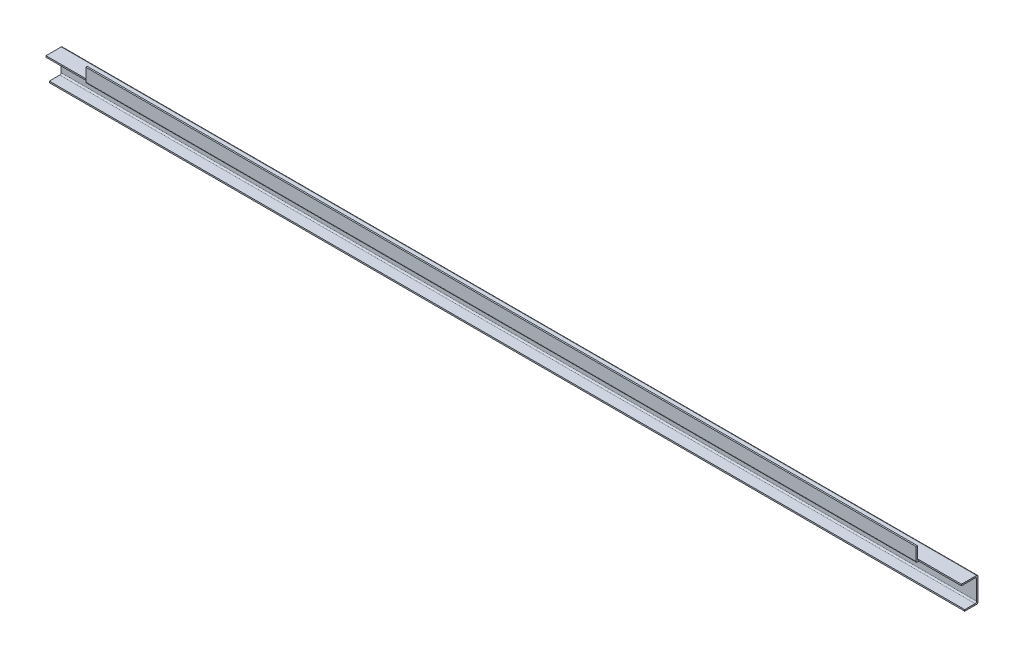
ISO-10303-21;
HEADER;
FILE_DESCRIPTION(('STEP AP214'),'2;1');
FILE_NAME('part.step','',(''),(''),'','','');
FILE_SCHEMA(('AUTOMOTIVE_DESIGN { 1 0 10303 214 1 1 1 1 }'));
ENDSEC;
DATA;
#1=APPLICATION_CONTEXT('core data for automotive mechanical design processes');
#2=APPLICATION_PROTOCOL_DEFINITION('international standard','automotive_design',2000,#1);
#3=PRODUCT_CONTEXT('',#1,'mechanical');
#4=PRODUCT('Part','Part','',(#3));
#5=PRODUCT_RELATED_PRODUCT_CATEGORY('part','',(#4));
#6=PRODUCT_DEFINITION_FORMATION('','',#4);
#7=PRODUCT_DEFINITION_CONTEXT('part definition',#1,'design');
#8=PRODUCT_DEFINITION('design','',#6,#7);
#9=PRODUCT_DEFINITION_SHAPE('','',#8);
#10=(LENGTH_UNIT() NAMED_UNIT(*) SI_UNIT(.MILLI.,.METRE.));
#11=(NAMED_UNIT(*) PLANE_ANGLE_UNIT() SI_UNIT($,.RADIAN.));
#12=(NAMED_UNIT(*) SI_UNIT($,.STERADIAN.) SOLID_ANGLE_UNIT());
#13=UNCERTAINTY_MEASURE_WITH_UNIT(LENGTH_MEASURE(1.E-05),#10,'distance_accuracy_value','');
#14=(GEOMETRIC_REPRESENTATION_CONTEXT(3) GLOBAL_UNCERTAINTY_ASSIGNED_CONTEXT((#13)) GLOBAL_UNIT_ASSIGNED_CONTEXT((#10,
#11,#12)) REPRESENTATION_CONTEXT('',''));
#15=CARTESIAN_POINT('',(0.,0.,0.));
#16=DIRECTION('',(0.,0.,1.));
#17=DIRECTION('',(1.,0.,0.));
#18=AXIS2_PLACEMENT_3D('',#15,#16,#17);
#19=CARTESIAN_POINT('',(1934.,0.,0.));
#20=DIRECTION('',(1.,0.,0.));
#21=DIRECTION('',(0.,0.,-1.));
#22=AXIS2_PLACEMENT_3D('',#19,#20,#21);
#23=PLANE('',#22);
#24=DIRECTION('',(0.,0.,1.));
#25=VECTOR('',#24,1.);
#26=CARTESIAN_POINT('',(1934.,50.,-28.));
#27=LINE('',#26,#25);
#28=CARTESIAN_POINT('',(1934.,50.,-25.));
#29=VERTEX_POINT('',#28);
#30=CARTESIAN_POINT('',(1934.,50.,7.00000000000001));
#31=VERTEX_POINT('',#30);
#32=EDGE_CURVE('E226',#29,#31,#27,.T.);
#33=ORIENTED_EDGE('',*,*,#32,.T.);
#34=DIRECTION('',(0.,1.,0.));
#35=VECTOR('',#34,1.);
#36=CARTESIAN_POINT('',(1934.,47.,7.00000000000001));
#37=LINE('',#36,#35);
#38=CARTESIAN_POINT('',(1934.,47.,7.00000000000001));
#39=VERTEX_POINT('',#38);
#40=EDGE_CURVE('E173',#39,#31,#37,.T.);
#41=ORIENTED_EDGE('',*,*,#40,.F.);
#42=DIRECTION('',(0.,0.,-1.));
#43=VECTOR('',#42,1.);
#44=CARTESIAN_POINT('',(1934.,47.,-25.));
#45=LINE('',#44,#43);
#46=CARTESIAN_POINT('',(1934.,47.,-22.));
#47=VERTEX_POINT('',#46);
#48=EDGE_CURVE('E183',#39,#47,#45,.T.);
#49=ORIENTED_EDGE('',*,*,#48,.T.);
#50=CARTESIAN_POINT('',(1934.,44.,-22.));
#51=DIRECTION('',(1.,0.,0.));
#52=DIRECTION('',(0.,0.,-1.));
#53=AXIS2_PLACEMENT_3D('',#50,#51,#52);
#54=CIRCLE('',#53,3.);
#55=CARTESIAN_POINT('',(1934.,44.,-25.));
#56=VERTEX_POINT('',#55);
#57=EDGE_CURVE('E307',#47,#56,#54,.F.);
#58=ORIENTED_EDGE('',*,*,#57,.T.);
#59=DIRECTION('',(0.,-1.,0.));
#60=VECTOR('',#59,1.);
#61=CARTESIAN_POINT('',(1934.,0.,-25.));
#62=LINE('',#61,#60);
#63=CARTESIAN_POINT('',(1934.,3.,-25.));
#64=VERTEX_POINT('',#63);
#65=EDGE_CURVE('E230',#56,#64,#62,.T.);
#66=ORIENTED_EDGE('',*,*,#65,.T.);
#67=CARTESIAN_POINT('',(1934.,3.,-22.));
#68=DIRECTION('',(1.,0.,0.));
#69=DIRECTION('',(0.,0.,-1.));
#70=AXIS2_PLACEMENT_3D('',#67,#68,#69);
#71=CIRCLE('',#70,3.);
#72=CARTESIAN_POINT('',(1934.,0.,-22.));
#73=VERTEX_POINT('',#72);
#74=EDGE_CURVE('E302',#64,#73,#71,.F.);
#75=ORIENTED_EDGE('',*,*,#74,.T.);
#76=DIRECTION('',(0.,0.,1.));
#77=VECTOR('',#76,1.);
#78=CARTESIAN_POINT('',(1934.,0.,0.));
#79=LINE('',#78,#77);
#80=CARTESIAN_POINT('',(1934.,0.,0.));
#81=VERTEX_POINT('',#80);
#82=EDGE_CURVE('E233',#73,#81,#79,.T.);
#83=ORIENTED_EDGE('',*,*,#82,.T.);
#84=DIRECTION('',(0.,-1.,0.));
#85=VECTOR('',#84,1.);
#86=CARTESIAN_POINT('',(1934.,0.,0.));
#87=LINE('',#86,#85);
#88=CARTESIAN_POINT('',(1934.,-3.,0.));
#89=VERTEX_POINT('',#88);
#90=EDGE_CURVE('E216',#81,#89,#87,.T.);
#91=ORIENTED_EDGE('',*,*,#90,.T.);
#92=DIRECTION('',(0.,0.,-1.));
#93=VECTOR('',#92,1.);
#94=CARTESIAN_POINT('',(1934.,-3.,0.));
#95=LINE('',#94,#93);
#96=CARTESIAN_POINT('',(1934.,-3.,-25.));
#97=VERTEX_POINT('',#96);
#98=EDGE_CURVE('E219',#89,#97,#95,.T.);
#99=ORIENTED_EDGE('',*,*,#98,.T.);
#100=CARTESIAN_POINT('',(1934.,0.,-25.));
#101=DIRECTION('',(1.,0.,0.));
#102=DIRECTION('',(0.,0.,-1.));
#103=AXIS2_PLACEMENT_3D('',#100,#101,#102);
#104=CIRCLE('',#103,3.);
#105=CARTESIAN_POINT('',(1934.,0.,-28.));
#106=VERTEX_POINT('',#105);
#107=EDGE_CURVE('E275',#97,#106,#104,.T.);
#108=ORIENTED_EDGE('',*,*,#107,.T.);
#109=DIRECTION('',(0.,1.,0.));
#110=VECTOR('',#109,1.);
#111=CARTESIAN_POINT('',(1934.,-3.,-28.));
#112=LINE('',#111,#110);
#113=CARTESIAN_POINT('',(1934.,47.,-28.));
#114=VERTEX_POINT('',#113);
#115=EDGE_CURVE('E223',#106,#114,#112,.T.);
#116=ORIENTED_EDGE('',*,*,#115,.T.);
#117=CARTESIAN_POINT('',(1934.,47.,-25.));
#118=DIRECTION('',(1.,0.,0.));
#119=DIRECTION('',(0.,0.,-1.));
#120=AXIS2_PLACEMENT_3D('',#117,#118,#119);
#121=CIRCLE('',#120,3.);
#122=EDGE_CURVE('E273',#114,#29,#121,.T.);
#123=ORIENTED_EDGE('',*,*,#122,.T.);
#124=EDGE_LOOP('',(#33,#41,#49,#58,#66,#75,#83,#91,#99,#108,#116,#123));
#125=FACE_BOUND('',#124,.T.);
#126=ADVANCED_FACE('F33',(#125),#23,.T.);
#127=CARTESIAN_POINT('',(1934.,0.,0.));
#128=DIRECTION('',(0.,0.,-1.));
#129=DIRECTION('',(-1.,0.,0.));
#130=AXIS2_PLACEMENT_3D('',#127,#128,#129);
#131=PLANE('',#130);
#132=DIRECTION('',(0.,-1.,0.));
#133=VECTOR('',#132,1.);
#134=CARTESIAN_POINT('',(0.,0.,0.));
#135=LINE('',#134,#133);
#136=CARTESIAN_POINT('',(0.,0.,0.));
#137=VERTEX_POINT('',#136);
#138=CARTESIAN_POINT('',(0.,-3.,0.));
#139=VERTEX_POINT('',#138);
#140=EDGE_CURVE('E215',#137,#139,#135,.T.);
#141=ORIENTED_EDGE('',*,*,#140,.T.);
#142=DIRECTION('',(-1.,0.,0.));
#143=VECTOR('',#142,1.);
#144=CARTESIAN_POINT('',(1934.,-3.,0.));
#145=LINE('',#144,#143);
#146=EDGE_CURVE('E259',#89,#139,#145,.T.);
#147=ORIENTED_EDGE('',*,*,#146,.F.);
#148=ORIENTED_EDGE('',*,*,#90,.F.);
#149=DIRECTION('',(-1.,0.,0.));
#150=VECTOR('',#149,1.);
#151=CARTESIAN_POINT('',(1934.,0.,0.));
#152=LINE('',#151,#150);
#153=EDGE_CURVE('E235',#81,#137,#152,.T.);
#154=ORIENTED_EDGE('',*,*,#153,.T.);
#155=EDGE_LOOP('',(#141,#147,#148,#154));
#156=FACE_BOUND('',#155,.T.);
#157=ADVANCED_FACE('F330',(#156),#131,.F.);
#158=CARTESIAN_POINT('',(1934.,-3.,0.));
#159=DIRECTION('',(0.,1.,0.));
#160=DIRECTION('',(0.,0.,1.));
#161=AXIS2_PLACEMENT_3D('',#158,#159,#160);
#162=PLANE('',#161);
#163=DIRECTION('',(0.,0.,-1.));
#164=VECTOR('',#163,1.);
#165=CARTESIAN_POINT('',(0.,-3.,0.));
#166=LINE('',#165,#164);
#167=CARTESIAN_POINT('',(0.,-3.,-25.));
#168=VERTEX_POINT('',#167);
#169=EDGE_CURVE('E238',#139,#168,#166,.T.);
#170=ORIENTED_EDGE('',*,*,#169,.T.);
#171=DIRECTION('',(-1.,0.,0.));
#172=VECTOR('',#171,1.);
#173=CARTESIAN_POINT('',(1934.,-3.,-25.));
#174=LINE('',#173,#172);
#175=EDGE_CURVE('E271',#168,#97,#174,.F.);
#176=ORIENTED_EDGE('',*,*,#175,.T.);
#177=ORIENTED_EDGE('',*,*,#98,.F.);
#178=ORIENTED_EDGE('',*,*,#146,.T.);
#179=EDGE_LOOP('',(#170,#176,#177,#178));
#180=FACE_BOUND('',#179,.T.);
#181=ADVANCED_FACE('F336',(#180),#162,.F.);
#182=CARTESIAN_POINT('',(1934.,-3.,-28.));
#183=DIRECTION('',(0.,0.,1.));
#184=DIRECTION('',(1.,0.,0.));
#185=AXIS2_PLACEMENT_3D('',#182,#183,#184);
#186=PLANE('',#185);
#187=ORIENTED_EDGE('',*,*,#115,.F.);
#188=DIRECTION('',(-1.,0.,0.));
#189=VECTOR('',#188,1.);
#190=CARTESIAN_POINT('',(1934.,0.,-28.));
#191=LINE('',#190,#189);
#192=CARTESIAN_POINT('',(0.,0.,-28.));
#193=VERTEX_POINT('',#192);
#194=EDGE_CURVE('E264',#106,#193,#191,.T.);
#195=ORIENTED_EDGE('',*,*,#194,.T.);
#196=DIRECTION('',(0.,1.,0.));
#197=VECTOR('',#196,1.);
#198=CARTESIAN_POINT('',(0.,-3.,-28.));
#199=LINE('',#198,#197);
#200=CARTESIAN_POINT('',(0.,47.,-28.));
#201=VERTEX_POINT('',#200);
#202=EDGE_CURVE('E241',#193,#201,#199,.T.);
#203=ORIENTED_EDGE('',*,*,#202,.T.);
#204=DIRECTION('',(-1.,0.,0.));
#205=VECTOR('',#204,1.);
#206=CARTESIAN_POINT('',(1934.,47.,-28.));
#207=LINE('',#206,#205);
#208=EDGE_CURVE('E262',#201,#114,#207,.F.);
#209=ORIENTED_EDGE('',*,*,#208,.T.);
#210=EDGE_LOOP('',(#187,#195,#203,#209));
#211=FACE_BOUND('',#210,.T.);
#212=ADVANCED_FACE('F369',(#211),#186,.F.);
#213=CARTESIAN_POINT('',(1934.,50.,-28.));
#214=DIRECTION('',(0.,-1.,0.));
#215=DIRECTION('',(0.,0.,-1.));
#216=AXIS2_PLACEMENT_3D('',#213,#214,#215);
#217=PLANE('',#216);
#218=ORIENTED_EDGE('',*,*,#32,.F.);
#219=DIRECTION('',(-1.,0.,0.));
#220=VECTOR('',#219,1.);
#221=CARTESIAN_POINT('',(1934.,50.,-25.));
#222=LINE('',#221,#220);
#223=CARTESIAN_POINT('',(0.,50.,-25.));
#224=VERTEX_POINT('',#223);
#225=EDGE_CURVE('E280',#29,#224,#222,.T.);
#226=ORIENTED_EDGE('',*,*,#225,.T.);
#227=DIRECTION('',(0.,0.,1.));
#228=VECTOR('',#227,1.);
#229=CARTESIAN_POINT('',(0.,50.,-28.));
#230=LINE('',#229,#228);
#231=CARTESIAN_POINT('',(0.,50.,7.00000000000001));
#232=VERTEX_POINT('',#231);
#233=EDGE_CURVE('E244',#224,#232,#230,.T.);
#234=ORIENTED_EDGE('',*,*,#233,.T.);
#235=DIRECTION('',(-1.,0.,0.));
#236=VECTOR('',#235,1.);
#237=CARTESIAN_POINT('',(1934.,50.,7.));
#238=LINE('',#237,#236);
#239=CARTESIAN_POINT('',(90.,50.,7.00000000000001));
#240=VERTEX_POINT('',#239);
#241=EDGE_CURVE('E277',#232,#240,#238,.F.);
#242=ORIENTED_EDGE('',*,*,#241,.T.);
#243=CARTESIAN_POINT('',(1844.,50.,7.00000000000001));
#244=VERTEX_POINT('',#243);
#245=EDGE_CURVE('E281',#240,#244,#238,.F.);
#246=ORIENTED_EDGE('',*,*,#245,.T.);
#247=EDGE_CURVE('E171',#244,#31,#238,.F.);
#248=ORIENTED_EDGE('',*,*,#247,.T.);
#249=EDGE_LOOP('',(#218,#226,#234,#242,#246,#248));
#250=FACE_BOUND('',#249,.T.);
#251=ADVANCED_FACE('F365',(#250),#217,.F.);
#252=CARTESIAN_POINT('',(1934.,50.,10.));
#253=DIRECTION('',(0.,0.,1.));
#254=DIRECTION('',(1.,0.,0.));
#255=AXIS2_PLACEMENT_3D('',#252,#253,#254);
#256=PLANE('',#255);
#257=DIRECTION('',(-1.,0.,0.));
#258=VECTOR('',#257,1.);
#259=CARTESIAN_POINT('',(1934.,77.,10.));
#260=LINE('',#259,#258);
#261=CARTESIAN_POINT('',(1844.,77.,10.));
#262=VERTEX_POINT('',#261);
#263=CARTESIAN_POINT('',(90.,77.,10.));
#264=VERTEX_POINT('',#263);
#265=EDGE_CURVE('E257',#262,#264,#260,.T.);
#266=ORIENTED_EDGE('',*,*,#265,.F.);
#267=DIRECTION('',(0.,-1.,0.));
#268=VECTOR('',#267,1.);
#269=CARTESIAN_POINT('',(1844.,50.,10.));
#270=LINE('',#269,#268);
#271=CARTESIAN_POINT('',(1844.,53.,10.));
#272=VERTEX_POINT('',#271);
#273=EDGE_CURVE('E190',#262,#272,#270,.T.);
#274=ORIENTED_EDGE('',*,*,#273,.T.);
#275=DIRECTION('',(-1.,0.,0.));
#276=VECTOR('',#275,1.);
#277=CARTESIAN_POINT('',(0.,53.,10.));
#278=LINE('',#277,#276);
#279=CARTESIAN_POINT('',(90.0000000000001,53.,10.));
#280=VERTEX_POINT('',#279);
#281=EDGE_CURVE('E284',#272,#280,#278,.T.);
#282=ORIENTED_EDGE('',*,*,#281,.T.);
#283=DIRECTION('',(0.,1.,0.));
#284=VECTOR('',#283,1.);
#285=CARTESIAN_POINT('',(90.0000000000001,50.,10.));
#286=LINE('',#285,#284);
#287=EDGE_CURVE('E212',#280,#264,#286,.T.);
#288=ORIENTED_EDGE('',*,*,#287,.T.);
#289=EDGE_LOOP('',(#266,#274,#282,#288));
#290=FACE_BOUND('',#289,.T.);
#291=ADVANCED_FACE('F361',(#290),#256,.F.);
#292=CARTESIAN_POINT('',(1934.,77.,13.));
#293=DIRECTION('',(0.,-1.,0.));
#294=DIRECTION('',(0.,0.,-1.));
#295=AXIS2_PLACEMENT_3D('',#292,#293,#294);
#296=PLANE('',#295);
#297=DIRECTION('',(-1.,0.,0.));
#298=VECTOR('',#297,1.);
#299=CARTESIAN_POINT('',(1934.,77.,13.));
#300=LINE('',#299,#298);
#301=CARTESIAN_POINT('',(1844.,77.,13.));
#302=VERTEX_POINT('',#301);
#303=CARTESIAN_POINT('',(90.,77.,13.));
#304=VERTEX_POINT('',#303);
#305=EDGE_CURVE('E255',#302,#304,#300,.T.);
#306=ORIENTED_EDGE('',*,*,#305,.F.);
#307=DIRECTION('',(0.,0.,1.));
#308=VECTOR('',#307,1.);
#309=CARTESIAN_POINT('',(1844.,77.,7.00000000000001));
#310=LINE('',#309,#308);
#311=EDGE_CURVE('E178',#262,#302,#310,.T.);
#312=ORIENTED_EDGE('',*,*,#311,.F.);
#313=ORIENTED_EDGE('',*,*,#265,.T.);
#314=DIRECTION('',(0.,0.,1.));
#315=VECTOR('',#314,1.);
#316=CARTESIAN_POINT('',(90.,77.,7.00000000000001));
#317=LINE('',#316,#315);
#318=EDGE_CURVE('E205',#264,#304,#317,.T.);
#319=ORIENTED_EDGE('',*,*,#318,.T.);
#320=EDGE_LOOP('',(#306,#312,#313,#319));
#321=FACE_BOUND('',#320,.T.);
#322=ADVANCED_FACE('F358',(#321),#296,.F.);
#323=CARTESIAN_POINT('',(1934.,47.,13.));
#324=DIRECTION('',(0.,0.,-1.));
#325=DIRECTION('',(0.,1.,0.));
#326=AXIS2_PLACEMENT_3D('',#323,#324,#325);
#327=PLANE('',#326);
#328=DIRECTION('',(-1.,0.,0.));
#329=VECTOR('',#328,1.);
#330=CARTESIAN_POINT('',(1934.,50.,13.));
#331=LINE('',#330,#329);
#332=CARTESIAN_POINT('',(90.,50.,13.));
#333=VERTEX_POINT('',#332);
#334=CARTESIAN_POINT('',(1844.,50.,13.));
#335=VERTEX_POINT('',#334);
#336=EDGE_CURVE('E297',#333,#335,#331,.F.);
#337=ORIENTED_EDGE('',*,*,#336,.T.);
#338=DIRECTION('',(0.,-1.,0.));
#339=VECTOR('',#338,1.);
#340=CARTESIAN_POINT('',(1844.,77.,13.));
#341=LINE('',#340,#339);
#342=EDGE_CURVE('E47',#302,#335,#341,.T.);
#343=ORIENTED_EDGE('',*,*,#342,.F.);
#344=ORIENTED_EDGE('',*,*,#305,.T.);
#345=DIRECTION('',(0.,1.,0.));
#346=VECTOR('',#345,1.);
#347=CARTESIAN_POINT('',(90.,77.,13.));
#348=LINE('',#347,#346);
#349=EDGE_CURVE('E193',#333,#304,#348,.T.);
#350=ORIENTED_EDGE('',*,*,#349,.F.);
#351=EDGE_LOOP('',(#337,#343,#344,#350));
#352=FACE_BOUND('',#351,.T.);
#353=ADVANCED_FACE('F316',(#352),#327,.F.);
#354=CARTESIAN_POINT('',(1934.,47.,-25.));
#355=DIRECTION('',(0.,1.,0.));
#356=DIRECTION('',(0.,0.,1.));
#357=AXIS2_PLACEMENT_3D('',#354,#355,#356);
#358=PLANE('',#357);
#359=DIRECTION('',(1.,0.,0.));
#360=VECTOR('',#359,1.);
#361=CARTESIAN_POINT('',(1844.,47.,7.00000000000001));
#362=LINE('',#361,#360);
#363=CARTESIAN_POINT('',(1844.,47.,7.00000000000001));
#364=VERTEX_POINT('',#363);
#365=EDGE_CURVE('E168',#364,#39,#362,.T.);
#366=ORIENTED_EDGE('',*,*,#365,.F.);
#367=DIRECTION('',(0.,0.,1.));
#368=VECTOR('',#367,1.);
#369=CARTESIAN_POINT('',(1844.,47.,7.00000000000001));
#370=LINE('',#369,#368);
#371=CARTESIAN_POINT('',(1844.,47.,10.));
#372=VERTEX_POINT('',#371);
#373=EDGE_CURVE('E175',#364,#372,#370,.T.);
#374=ORIENTED_EDGE('',*,*,#373,.T.);
#375=DIRECTION('',(-1.,0.,0.));
#376=VECTOR('',#375,1.);
#377=CARTESIAN_POINT('',(1934.,47.,10.));
#378=LINE('',#377,#376);
#379=CARTESIAN_POINT('',(90.0000000000001,47.,10.));
#380=VERTEX_POINT('',#379);
#381=EDGE_CURVE('E55',#372,#380,#378,.T.);
#382=ORIENTED_EDGE('',*,*,#381,.T.);
#383=DIRECTION('',(0.,0.,1.));
#384=VECTOR('',#383,1.);
#385=CARTESIAN_POINT('',(90.,47.,7.00000000000001));
#386=LINE('',#385,#384);
#387=CARTESIAN_POINT('',(90.,47.,7.00000000000001));
#388=VERTEX_POINT('',#387);
#389=EDGE_CURVE('E202',#388,#380,#386,.T.);
#390=ORIENTED_EDGE('',*,*,#389,.F.);
#391=DIRECTION('',(1.,0.,0.));
#392=VECTOR('',#391,1.);
#393=CARTESIAN_POINT('',(90.,47.,7.00000000000001));
#394=LINE('',#393,#392);
#395=CARTESIAN_POINT('',(0.,47.,7.00000000000001));
#396=VERTEX_POINT('',#395);
#397=EDGE_CURVE('E196',#396,#388,#394,.T.);
#398=ORIENTED_EDGE('',*,*,#397,.F.);
#399=DIRECTION('',(0.,0.,-1.));
#400=VECTOR('',#399,1.);
#401=CARTESIAN_POINT('',(0.,47.,-25.));
#402=LINE('',#401,#400);
#403=CARTESIAN_POINT('',(0.,47.,-22.));
#404=VERTEX_POINT('',#403);
#405=EDGE_CURVE('E247',#396,#404,#402,.T.);
#406=ORIENTED_EDGE('',*,*,#405,.T.);
#407=DIRECTION('',(-1.,0.,0.));
#408=VECTOR('',#407,1.);
#409=CARTESIAN_POINT('',(1934.,47.,-22.));
#410=LINE('',#409,#408);
#411=EDGE_CURVE('E295',#404,#47,#410,.F.);
#412=ORIENTED_EDGE('',*,*,#411,.T.);
#413=ORIENTED_EDGE('',*,*,#48,.F.);
#414=EDGE_LOOP('',(#366,#374,#382,#390,#398,#406,#412,#413));
#415=FACE_BOUND('',#414,.T.);
#416=ADVANCED_FACE('F181',(#415),#358,.F.);
#417=CARTESIAN_POINT('',(1934.,0.,-25.));
#418=DIRECTION('',(0.,0.,-1.));
#419=DIRECTION('',(-1.,0.,0.));
#420=AXIS2_PLACEMENT_3D('',#417,#418,#419);
#421=PLANE('',#420);
#422=DIRECTION('',(0.,-1.,0.));
#423=VECTOR('',#422,1.);
#424=CARTESIAN_POINT('',(0.,0.,-25.));
#425=LINE('',#424,#423);
#426=CARTESIAN_POINT('',(0.,44.,-25.));
#427=VERTEX_POINT('',#426);
#428=CARTESIAN_POINT('',(0.,3.,-25.));
#429=VERTEX_POINT('',#428);
#430=EDGE_CURVE('E249',#427,#429,#425,.T.);
#431=ORIENTED_EDGE('',*,*,#430,.T.);
#432=DIRECTION('',(-1.,0.,0.));
#433=VECTOR('',#432,1.);
#434=CARTESIAN_POINT('',(1934.,3.,-25.));
#435=LINE('',#434,#433);
#436=EDGE_CURVE('E292',#429,#64,#435,.F.);
#437=ORIENTED_EDGE('',*,*,#436,.T.);
#438=ORIENTED_EDGE('',*,*,#65,.F.);
#439=DIRECTION('',(-1.,0.,0.));
#440=VECTOR('',#439,1.);
#441=CARTESIAN_POINT('',(0.,44.,-25.));
#442=LINE('',#441,#440);
#443=EDGE_CURVE('E289',#56,#427,#442,.T.);
#444=ORIENTED_EDGE('',*,*,#443,.T.);
#445=EDGE_LOOP('',(#431,#437,#438,#444));
#446=FACE_BOUND('',#445,.T.);
#447=ADVANCED_FACE('F349',(#446),#421,.F.);
#448=CARTESIAN_POINT('',(1934.,0.,0.));
#449=DIRECTION('',(0.,-1.,0.));
#450=DIRECTION('',(0.,0.,-1.));
#451=AXIS2_PLACEMENT_3D('',#448,#449,#450);
#452=PLANE('',#451);
#453=ORIENTED_EDGE('',*,*,#82,.F.);
#454=DIRECTION('',(-1.,0.,0.));
#455=VECTOR('',#454,1.);
#456=CARTESIAN_POINT('',(0.,0.,-22.));
#457=LINE('',#456,#455);
#458=CARTESIAN_POINT('',(0.,0.,-22.));
#459=VERTEX_POINT('',#458);
#460=EDGE_CURVE('E286',#73,#459,#457,.T.);
#461=ORIENTED_EDGE('',*,*,#460,.T.);
#462=DIRECTION('',(0.,0.,1.));
#463=VECTOR('',#462,1.);
#464=CARTESIAN_POINT('',(0.,0.,0.));
#465=LINE('',#464,#463);
#466=EDGE_CURVE('E220',#459,#137,#465,.T.);
#467=ORIENTED_EDGE('',*,*,#466,.T.);
#468=ORIENTED_EDGE('',*,*,#153,.F.);
#469=EDGE_LOOP('',(#453,#461,#467,#468));
#470=FACE_BOUND('',#469,.T.);
#471=ADVANCED_FACE('F345',(#470),#452,.F.);
#472=CARTESIAN_POINT('',(0.,0.,0.));
#473=DIRECTION('',(1.,0.,0.));
#474=DIRECTION('',(0.,0.,-1.));
#475=AXIS2_PLACEMENT_3D('',#472,#473,#474);
#476=PLANE('',#475);
#477=ORIENTED_EDGE('',*,*,#405,.F.);
#478=DIRECTION('',(0.,-1.,0.));
#479=VECTOR('',#478,1.);
#480=CARTESIAN_POINT('',(0.,47.,7.00000000000001));
#481=LINE('',#480,#479);
#482=EDGE_CURVE('E194',#232,#396,#481,.T.);
#483=ORIENTED_EDGE('',*,*,#482,.F.);
#484=ORIENTED_EDGE('',*,*,#233,.F.);
#485=CARTESIAN_POINT('',(0.,47.,-25.));
#486=DIRECTION('',(1.,0.,0.));
#487=DIRECTION('',(0.,0.,-1.));
#488=AXIS2_PLACEMENT_3D('',#485,#486,#487);
#489=CIRCLE('',#488,3.);
#490=EDGE_CURVE('E267',#224,#201,#489,.F.);
#491=ORIENTED_EDGE('',*,*,#490,.T.);
#492=ORIENTED_EDGE('',*,*,#202,.F.);
#493=CARTESIAN_POINT('',(0.,0.,-25.));
#494=DIRECTION('',(1.,0.,0.));
#495=DIRECTION('',(0.,0.,-1.));
#496=AXIS2_PLACEMENT_3D('',#493,#494,#495);
#497=CIRCLE('',#496,3.);
#498=EDGE_CURVE('E269',#193,#168,#497,.F.);
#499=ORIENTED_EDGE('',*,*,#498,.T.);
#500=ORIENTED_EDGE('',*,*,#169,.F.);
#501=ORIENTED_EDGE('',*,*,#140,.F.);
#502=ORIENTED_EDGE('',*,*,#466,.F.);
#503=CARTESIAN_POINT('',(0.,3.,-22.));
#504=DIRECTION('',(1.,0.,0.));
#505=DIRECTION('',(0.,0.,-1.));
#506=AXIS2_PLACEMENT_3D('',#503,#504,#505);
#507=CIRCLE('',#506,3.);
#508=EDGE_CURVE('E300',#459,#429,#507,.T.);
#509=ORIENTED_EDGE('',*,*,#508,.T.);
#510=ORIENTED_EDGE('',*,*,#430,.F.);
#511=CARTESIAN_POINT('',(0.,44.,-22.));
#512=DIRECTION('',(1.,0.,0.));
#513=DIRECTION('',(0.,0.,-1.));
#514=AXIS2_PLACEMENT_3D('',#511,#512,#513);
#515=CIRCLE('',#514,3.);
#516=EDGE_CURVE('E304',#427,#404,#515,.T.);
#517=ORIENTED_EDGE('',*,*,#516,.T.);
#518=EDGE_LOOP('',(#477,#483,#484,#491,#492,#499,#500,#501,#502,#509,#510,#517));
#519=FACE_BOUND('',#518,.T.);
#520=ADVANCED_FACE('F341',(#519),#476,.F.);
#521=CARTESIAN_POINT('',(1934.,0.,-25.));
#522=DIRECTION('',(-1.,0.,0.));
#523=DIRECTION('',(0.,0.,1.));
#524=AXIS2_PLACEMENT_3D('',#521,#522,#523);
#525=CYLINDRICAL_SURFACE('',#524,3.);
#526=ORIENTED_EDGE('',*,*,#107,.F.);
#527=ORIENTED_EDGE('',*,*,#175,.F.);
#528=ORIENTED_EDGE('',*,*,#498,.F.);
#529=ORIENTED_EDGE('',*,*,#194,.F.);
#530=EDGE_LOOP('',(#526,#527,#528,#529));
#531=FACE_BOUND('',#530,.T.);
#532=ADVANCED_FACE('F344',(#531),#525,.T.);
#533=CARTESIAN_POINT('',(1934.,47.,-25.));
#534=DIRECTION('',(-1.,0.,0.));
#535=DIRECTION('',(0.,0.,1.));
#536=AXIS2_PLACEMENT_3D('',#533,#534,#535);
#537=CYLINDRICAL_SURFACE('',#536,3.);
#538=ORIENTED_EDGE('',*,*,#122,.F.);
#539=ORIENTED_EDGE('',*,*,#208,.F.);
#540=ORIENTED_EDGE('',*,*,#490,.F.);
#541=ORIENTED_EDGE('',*,*,#225,.F.);
#542=EDGE_LOOP('',(#538,#539,#540,#541));
#543=FACE_BOUND('',#542,.T.);
#544=ADVANCED_FACE('F379',(#543),#537,.T.);
#545=CARTESIAN_POINT('',(1934.,53.,7.));
#546=DIRECTION('',(1.,0.,0.));
#547=DIRECTION('',(0.,0.,-1.));
#548=AXIS2_PLACEMENT_3D('',#545,#546,#547);
#549=CYLINDRICAL_SURFACE('',#548,3.);
#550=ORIENTED_EDGE('',*,*,#281,.F.);
#551=CARTESIAN_POINT('',(1844.,53.,7.));
#552=DIRECTION('',(-1.,0.,0.));
#553=DIRECTION('',(0.,0.,1.));
#554=AXIS2_PLACEMENT_3D('',#551,#552,#553);
#555=CIRCLE('',#554,3.);
#556=EDGE_CURVE('E177',#272,#244,#555,.F.);
#557=ORIENTED_EDGE('',*,*,#556,.T.);
#558=ORIENTED_EDGE('',*,*,#245,.F.);
#559=CARTESIAN_POINT('',(90.0000000000001,53.,7.));
#560=DIRECTION('',(1.,0.,0.));
#561=DIRECTION('',(0.,0.,-1.));
#562=AXIS2_PLACEMENT_3D('',#559,#560,#561);
#563=CIRCLE('',#562,3.);
#564=EDGE_CURVE('E208',#240,#280,#563,.F.);
#565=ORIENTED_EDGE('',*,*,#564,.T.);
#566=EDGE_LOOP('',(#550,#557,#558,#565));
#567=FACE_BOUND('',#566,.T.);
#568=ADVANCED_FACE('F383',(#567),#549,.F.);
#569=CARTESIAN_POINT('',(1934.,3.,-22.));
#570=DIRECTION('',(1.,0.,0.));
#571=DIRECTION('',(0.,0.,-1.));
#572=AXIS2_PLACEMENT_3D('',#569,#570,#571);
#573=CYLINDRICAL_SURFACE('',#572,3.);
#574=ORIENTED_EDGE('',*,*,#74,.F.);
#575=ORIENTED_EDGE('',*,*,#436,.F.);
#576=ORIENTED_EDGE('',*,*,#508,.F.);
#577=ORIENTED_EDGE('',*,*,#460,.F.);
#578=EDGE_LOOP('',(#574,#575,#576,#577));
#579=FACE_BOUND('',#578,.T.);
#580=ADVANCED_FACE('F327',(#579),#573,.F.);
#581=CARTESIAN_POINT('',(1934.,44.,-22.));
#582=DIRECTION('',(1.,0.,0.));
#583=DIRECTION('',(0.,0.,-1.));
#584=AXIS2_PLACEMENT_3D('',#581,#582,#583);
#585=CYLINDRICAL_SURFACE('',#584,3.);
#586=ORIENTED_EDGE('',*,*,#57,.F.);
#587=ORIENTED_EDGE('',*,*,#411,.F.);
#588=ORIENTED_EDGE('',*,*,#516,.F.);
#589=ORIENTED_EDGE('',*,*,#443,.F.);
#590=EDGE_LOOP('',(#586,#587,#588,#589));
#591=FACE_BOUND('',#590,.T.);
#592=ADVANCED_FACE('F320',(#591),#585,.F.);
#593=CARTESIAN_POINT('',(1934.,50.,10.));
#594=DIRECTION('',(-1.,0.,0.));
#595=DIRECTION('',(0.,0.,1.));
#596=AXIS2_PLACEMENT_3D('',#593,#594,#595);
#597=CYLINDRICAL_SURFACE('',#596,3.);
#598=CARTESIAN_POINT('',(1844.,50.,10.));
#599=DIRECTION('',(-1.,0.,0.));
#600=DIRECTION('',(0.,0.,1.));
#601=AXIS2_PLACEMENT_3D('',#598,#599,#600);
#602=CIRCLE('',#601,3.);
#603=EDGE_CURVE('E11',#335,#372,#602,.F.);
#604=ORIENTED_EDGE('',*,*,#603,.F.);
#605=ORIENTED_EDGE('',*,*,#336,.F.);
#606=CARTESIAN_POINT('',(90.0000000000001,50.,10.));
#607=DIRECTION('',(1.,0.,0.));
#608=DIRECTION('',(0.,0.,-1.));
#609=AXIS2_PLACEMENT_3D('',#606,#607,#608);
#610=CIRCLE('',#609,3.);
#611=EDGE_CURVE('E41',#380,#333,#610,.F.);
#612=ORIENTED_EDGE('',*,*,#611,.F.);
#613=ORIENTED_EDGE('',*,*,#381,.F.);
#614=EDGE_LOOP('',(#604,#605,#612,#613));
#615=FACE_BOUND('',#614,.T.);
#616=ADVANCED_FACE('F35',(#615),#597,.T.);
#617=CARTESIAN_POINT('',(0.,0.,7.00000000000001));
#618=DIRECTION('',(0.,0.,-1.));
#619=DIRECTION('',(-1.,0.,0.));
#620=AXIS2_PLACEMENT_3D('',#617,#618,#619);
#621=PLANE('',#620);
#622=ORIENTED_EDGE('',*,*,#482,.T.);
#623=ORIENTED_EDGE('',*,*,#397,.T.);
#624=DIRECTION('',(0.,1.,0.));
#625=VECTOR('',#624,1.);
#626=CARTESIAN_POINT('',(90.,77.,7.00000000000001));
#627=LINE('',#626,#625);
#628=EDGE_CURVE('E199',#388,#240,#627,.T.);
#629=ORIENTED_EDGE('',*,*,#628,.T.);
#630=ORIENTED_EDGE('',*,*,#241,.F.);
#631=EDGE_LOOP('',(#622,#623,#629,#630));
#632=FACE_BOUND('',#631,.T.);
#633=ADVANCED_FACE('F319',(#632),#621,.F.);
#634=CARTESIAN_POINT('',(90.,77.,7.00000000000001));
#635=DIRECTION('',(1.,0.,0.));
#636=DIRECTION('',(0.,0.,-1.));
#637=AXIS2_PLACEMENT_3D('',#634,#635,#636);
#638=PLANE('',#637);
#639=ORIENTED_EDGE('',*,*,#564,.F.);
#640=ORIENTED_EDGE('',*,*,#628,.F.);
#641=ORIENTED_EDGE('',*,*,#389,.T.);
#642=ORIENTED_EDGE('',*,*,#611,.T.);
#643=ORIENTED_EDGE('',*,*,#349,.T.);
#644=ORIENTED_EDGE('',*,*,#318,.F.);
#645=ORIENTED_EDGE('',*,*,#287,.F.);
#646=EDGE_LOOP('',(#639,#640,#641,#642,#643,#644,#645));
#647=FACE_BOUND('',#646,.T.);
#648=ADVANCED_FACE('F311',(#647),#638,.F.);
#649=CARTESIAN_POINT('',(0.,0.,7.00000000000001));
#650=DIRECTION('',(0.,0.,1.));
#651=DIRECTION('',(1.,0.,0.));
#652=AXIS2_PLACEMENT_3D('',#649,#650,#651);
#653=PLANE('',#652);
#654=ORIENTED_EDGE('',*,*,#247,.F.);
#655=DIRECTION('',(0.,-1.,0.));
#656=VECTOR('',#655,1.);
#657=CARTESIAN_POINT('',(1844.,77.,7.00000000000001));
#658=LINE('',#657,#656);
#659=EDGE_CURVE('E164',#244,#364,#658,.T.);
#660=ORIENTED_EDGE('',*,*,#659,.T.);
#661=ORIENTED_EDGE('',*,*,#365,.T.);
#662=ORIENTED_EDGE('',*,*,#40,.T.);
#663=EDGE_LOOP('',(#654,#660,#661,#662));
#664=FACE_BOUND('',#663,.T.);
#665=ADVANCED_FACE('F166',(#664),#653,.T.);
#666=CARTESIAN_POINT('',(1844.,77.,7.00000000000001));
#667=DIRECTION('',(-1.,0.,0.));
#668=DIRECTION('',(0.,0.,1.));
#669=AXIS2_PLACEMENT_3D('',#666,#667,#668);
#670=PLANE('',#669);
#671=ORIENTED_EDGE('',*,*,#311,.T.);
#672=ORIENTED_EDGE('',*,*,#342,.T.);
#673=ORIENTED_EDGE('',*,*,#603,.T.);
#674=ORIENTED_EDGE('',*,*,#373,.F.);
#675=ORIENTED_EDGE('',*,*,#659,.F.);
#676=ORIENTED_EDGE('',*,*,#556,.F.);
#677=ORIENTED_EDGE('',*,*,#273,.F.);
#678=EDGE_LOOP('',(#671,#672,#673,#674,#675,#676,#677));
#679=FACE_BOUND('',#678,.T.);
#680=ADVANCED_FACE('F176',(#679),#670,.F.);
#681=CLOSED_SHELL('',(#126,#157,#181,#212,#251,#291,#322,#353,#416,#447,#471,#520,#532,#544,
#568,#580,#592,#616,#633,#648,#665,#680));
#682=MANIFOLD_SOLID_BREP('B2',#681);
#683=ADVANCED_BREP_SHAPE_REPRESENTATION('',(#18,#682),#14);
#684=SHAPE_DEFINITION_REPRESENTATION(#9,#683);
ENDSEC;
END-ISO-10303-21;
